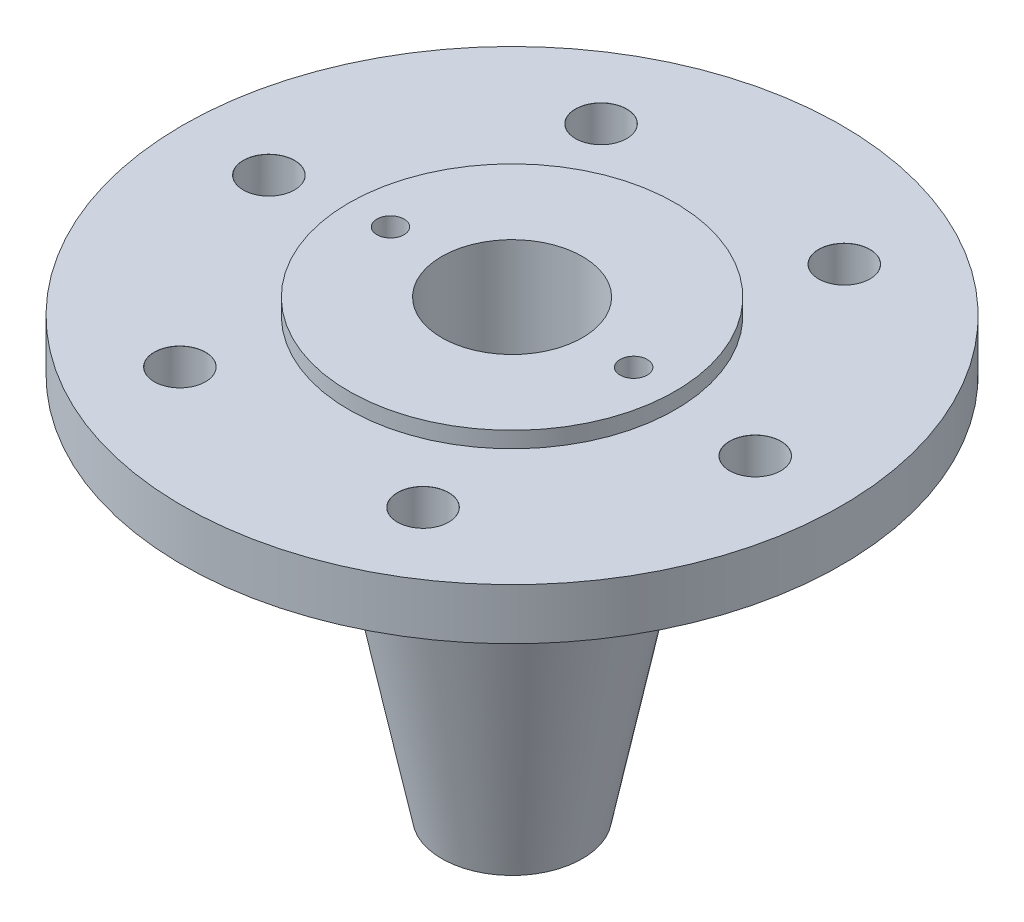
ISO-10303-21;
HEADER;
FILE_DESCRIPTION(('STEP AP214'),'2;1');
FILE_NAME('part.step','',(''),(''),'','','');
FILE_SCHEMA(('AUTOMOTIVE_DESIGN { 1 0 10303 214 1 1 1 1 }'));
ENDSEC;
DATA;
#1=APPLICATION_CONTEXT('core data for automotive mechanical design processes');
#2=APPLICATION_PROTOCOL_DEFINITION('international standard','automotive_design',2000,#1);
#3=PRODUCT_CONTEXT('',#1,'mechanical');
#4=PRODUCT('Part','Part','',(#3));
#5=PRODUCT_RELATED_PRODUCT_CATEGORY('part','',(#4));
#6=PRODUCT_DEFINITION_FORMATION('','',#4);
#7=PRODUCT_DEFINITION_CONTEXT('part definition',#1,'design');
#8=PRODUCT_DEFINITION('design','',#6,#7);
#9=PRODUCT_DEFINITION_SHAPE('','',#8);
#10=(LENGTH_UNIT() NAMED_UNIT(*) SI_UNIT(.MILLI.,.METRE.));
#11=(NAMED_UNIT(*) PLANE_ANGLE_UNIT() SI_UNIT($,.RADIAN.));
#12=(NAMED_UNIT(*) SI_UNIT($,.STERADIAN.) SOLID_ANGLE_UNIT());
#13=UNCERTAINTY_MEASURE_WITH_UNIT(LENGTH_MEASURE(1.E-05),#10,'distance_accuracy_value','');
#14=(GEOMETRIC_REPRESENTATION_CONTEXT(3) GLOBAL_UNCERTAINTY_ASSIGNED_CONTEXT((#13)) GLOBAL_UNIT_ASSIGNED_CONTEXT((#10,
#11,#12)) REPRESENTATION_CONTEXT('',''));
#15=CARTESIAN_POINT('',(0.,0.,0.));
#16=DIRECTION('',(0.,0.,1.));
#17=DIRECTION('',(1.,0.,0.));
#18=AXIS2_PLACEMENT_3D('',#15,#16,#17);
#19=CARTESIAN_POINT('',(51.,-5.,0.));
#20=DIRECTION('',(0.,-1.,0.));
#21=DIRECTION('',(1.,0.,0.));
#22=AXIS2_PLACEMENT_3D('',#19,#20,#21);
#23=PLANE('',#22);
#24=CARTESIAN_POINT('',(0.,-5.,0.));
#25=DIRECTION('',(0.,1.,0.));
#26=DIRECTION('',(-1.,0.,0.));
#27=AXIS2_PLACEMENT_3D('',#24,#25,#26);
#28=CIRCLE('',#27,51.);
#29=CARTESIAN_POINT('',(-51.,-5.00000000000001,0.));
#30=VERTEX_POINT('',#29);
#31=EDGE_CURVE('E219',#30,#30,#28,.T.);
#32=ORIENTED_EDGE('',*,*,#31,.F.);
#33=EDGE_LOOP('',(#32));
#34=FACE_BOUND('',#33,.T.);
#35=CARTESIAN_POINT('',(0.,-5.,0.));
#36=DIRECTION('',(0.,1.,0.));
#37=DIRECTION('',(-1.,0.,0.));
#38=AXIS2_PLACEMENT_3D('',#35,#36,#37);
#39=CIRCLE('',#38,103.);
#40=CARTESIAN_POINT('',(-103.,-5.00000000000002,0.));
#41=VERTEX_POINT('',#40);
#42=EDGE_CURVE('E215',#41,#41,#39,.T.);
#43=ORIENTED_EDGE('',*,*,#42,.T.);
#44=EDGE_LOOP('',(#43));
#45=FACE_BOUND('',#44,.T.);
#46=CARTESIAN_POINT('',(-76.,-5.,0.));
#47=DIRECTION('',(0.,1.,0.));
#48=DIRECTION('',(0.,0.,1.));
#49=AXIS2_PLACEMENT_3D('',#46,#47,#48);
#50=CIRCLE('',#49,8.025);
#51=CARTESIAN_POINT('',(-76.,-5.,8.025));
#52=VERTEX_POINT('',#51);
#53=EDGE_CURVE('E155',#52,#52,#50,.T.);
#54=ORIENTED_EDGE('',*,*,#53,.F.);
#55=EDGE_LOOP('',(#54));
#56=FACE_BOUND('',#55,.T.);
#57=CARTESIAN_POINT('',(-37.9999999999998,-5.,65.8179306876174));
#58=DIRECTION('',(0.,1.,0.));
#59=DIRECTION('',(0.,0.,1.));
#60=AXIS2_PLACEMENT_3D('',#57,#58,#59);
#61=CIRCLE('',#60,8.025);
#62=CARTESIAN_POINT('',(-37.9999999999998,-5.,73.8429306876174));
#63=VERTEX_POINT('',#62);
#64=EDGE_CURVE('E143',#63,#63,#61,.T.);
#65=ORIENTED_EDGE('',*,*,#64,.F.);
#66=EDGE_LOOP('',(#65));
#67=FACE_BOUND('',#66,.T.);
#68=CARTESIAN_POINT('',(38.0000000000003,-5.,65.8179306876172));
#69=DIRECTION('',(0.,1.,0.));
#70=DIRECTION('',(0.,0.,1.));
#71=AXIS2_PLACEMENT_3D('',#68,#69,#70);
#72=CIRCLE('',#71,8.025);
#73=CARTESIAN_POINT('',(38.0000000000003,-5.,73.8429306876172));
#74=VERTEX_POINT('',#73);
#75=EDGE_CURVE('E131',#74,#74,#72,.T.);
#76=ORIENTED_EDGE('',*,*,#75,.F.);
#77=EDGE_LOOP('',(#76));
#78=FACE_BOUND('',#77,.T.);
#79=CARTESIAN_POINT('',(76.,-5.,0.));
#80=DIRECTION('',(0.,1.,0.));
#81=DIRECTION('',(0.,0.,1.));
#82=AXIS2_PLACEMENT_3D('',#79,#80,#81);
#83=CIRCLE('',#82,8.025);
#84=CARTESIAN_POINT('',(76.,-5.,8.025));
#85=VERTEX_POINT('',#84);
#86=EDGE_CURVE('E119',#85,#85,#83,.T.);
#87=ORIENTED_EDGE('',*,*,#86,.F.);
#88=EDGE_LOOP('',(#87));
#89=FACE_BOUND('',#88,.T.);
#90=CARTESIAN_POINT('',(37.9999999999994,-5.,-65.8179306876177));
#91=DIRECTION('',(0.,1.,0.));
#92=DIRECTION('',(0.,0.,1.));
#93=AXIS2_PLACEMENT_3D('',#90,#91,#92);
#94=CIRCLE('',#93,8.025);
#95=CARTESIAN_POINT('',(37.9999999999994,-5.,-57.7929306876177));
#96=VERTEX_POINT('',#95);
#97=EDGE_CURVE('E107',#96,#96,#94,.T.);
#98=ORIENTED_EDGE('',*,*,#97,.F.);
#99=EDGE_LOOP('',(#98));
#100=FACE_BOUND('',#99,.T.);
#101=CARTESIAN_POINT('',(-38.0000000000008,-5.,-65.8179306876169));
#102=DIRECTION('',(0.,1.,0.));
#103=DIRECTION('',(0.,0.,1.));
#104=AXIS2_PLACEMENT_3D('',#101,#102,#103);
#105=CIRCLE('',#104,8.025);
#106=CARTESIAN_POINT('',(-38.0000000000008,-5.,-57.7929306876169));
#107=VERTEX_POINT('',#106);
#108=EDGE_CURVE('E95',#107,#107,#105,.T.);
#109=ORIENTED_EDGE('',*,*,#108,.F.);
#110=EDGE_LOOP('',(#109));
#111=FACE_BOUND('',#110,.T.);
#112=ADVANCED_FACE('F54',(#34,#45,#56,#67,#78,#89,#100,#111),#23,.F.);
#113=CARTESIAN_POINT('',(0.,0.,0.));
#114=DIRECTION('',(0.,-1.,0.));
#115=DIRECTION('',(1.,0.,0.));
#116=AXIS2_PLACEMENT_3D('',#113,#114,#115);
#117=PLANE('',#116);
#118=CARTESIAN_POINT('',(-38.,0.,0.));
#119=DIRECTION('',(0.,1.,0.));
#120=DIRECTION('',(0.,0.,1.));
#121=AXIS2_PLACEMENT_3D('',#118,#119,#120);
#122=CIRCLE('',#121,4.24999999999999);
#123=CARTESIAN_POINT('',(-38.,0.,4.24999999999999));
#124=VERTEX_POINT('',#123);
#125=EDGE_CURVE('E81',#124,#124,#122,.T.);
#126=ORIENTED_EDGE('',*,*,#125,.F.);
#127=EDGE_LOOP('',(#126));
#128=FACE_BOUND('',#127,.T.);
#129=CARTESIAN_POINT('',(38.,0.,0.));
#130=DIRECTION('',(0.,1.,0.));
#131=DIRECTION('',(0.,0.,1.));
#132=AXIS2_PLACEMENT_3D('',#129,#130,#131);
#133=CIRCLE('',#132,4.24999999999999);
#134=CARTESIAN_POINT('',(38.,0.,4.24999999999999));
#135=VERTEX_POINT('',#134);
#136=EDGE_CURVE('E80',#135,#135,#133,.T.);
#137=ORIENTED_EDGE('',*,*,#136,.F.);
#138=EDGE_LOOP('',(#137));
#139=FACE_BOUND('',#138,.T.);
#140=CARTESIAN_POINT('',(0.,0.,0.));
#141=DIRECTION('',(0.,1.,0.));
#142=DIRECTION('',(-1.,0.,0.));
#143=AXIS2_PLACEMENT_3D('',#140,#141,#142);
#144=CIRCLE('',#143,22.);
#145=CARTESIAN_POINT('',(-22.,0.,0.));
#146=VERTEX_POINT('',#145);
#147=EDGE_CURVE('E195',#146,#146,#144,.T.);
#148=ORIENTED_EDGE('',*,*,#147,.F.);
#149=EDGE_LOOP('',(#148));
#150=FACE_BOUND('',#149,.T.);
#151=CARTESIAN_POINT('',(0.,0.,0.));
#152=DIRECTION('',(0.,1.,0.));
#153=DIRECTION('',(-1.,0.,0.));
#154=AXIS2_PLACEMENT_3D('',#151,#152,#153);
#155=CIRCLE('',#154,51.);
#156=CARTESIAN_POINT('',(-51.,0.,0.));
#157=VERTEX_POINT('',#156);
#158=EDGE_CURVE('E223',#157,#157,#155,.T.);
#159=ORIENTED_EDGE('',*,*,#158,.T.);
#160=EDGE_LOOP('',(#159));
#161=FACE_BOUND('',#160,.T.);
#162=ADVANCED_FACE('F250',(#128,#139,#150,#161),#117,.F.);
#163=CARTESIAN_POINT('',(0.,0.,0.));
#164=DIRECTION('',(0.,1.,0.));
#165=DIRECTION('',(-1.,0.,0.));
#166=AXIS2_PLACEMENT_3D('',#163,#164,#165);
#167=CYLINDRICAL_SURFACE('',#166,51.);
#168=ORIENTED_EDGE('',*,*,#158,.F.);
#169=EDGE_LOOP('',(#168));
#170=FACE_BOUND('',#169,.T.);
#171=ORIENTED_EDGE('',*,*,#31,.T.);
#172=EDGE_LOOP('',(#171));
#173=FACE_BOUND('',#172,.T.);
#174=ADVANCED_FACE('F256',(#170,#173),#167,.T.);
#175=CARTESIAN_POINT('',(0.,0.,0.));
#176=DIRECTION('',(0.,1.,0.));
#177=DIRECTION('',(-1.,0.,0.));
#178=AXIS2_PLACEMENT_3D('',#175,#176,#177);
#179=CYLINDRICAL_SURFACE('',#178,103.);
#180=ORIENTED_EDGE('',*,*,#42,.F.);
#181=EDGE_LOOP('',(#180));
#182=FACE_BOUND('',#181,.T.);
#183=CARTESIAN_POINT('',(0.,-21.,0.));
#184=DIRECTION('',(0.,1.,0.));
#185=DIRECTION('',(-1.,0.,0.));
#186=AXIS2_PLACEMENT_3D('',#183,#184,#185);
#187=CIRCLE('',#186,103.);
#188=CARTESIAN_POINT('',(-103.,-21.,0.));
#189=VERTEX_POINT('',#188);
#190=EDGE_CURVE('E211',#189,#189,#187,.T.);
#191=ORIENTED_EDGE('',*,*,#190,.T.);
#192=EDGE_LOOP('',(#191));
#193=FACE_BOUND('',#192,.T.);
#194=ADVANCED_FACE('F262',(#182,#193),#179,.T.);
#195=CARTESIAN_POINT('',(103.,-21.,0.));
#196=DIRECTION('',(0.,1.,0.));
#197=DIRECTION('',(-1.,0.,0.));
#198=AXIS2_PLACEMENT_3D('',#195,#196,#197);
#199=PLANE('',#198);
#200=CARTESIAN_POINT('',(-38.0000000000008,-21.,-65.8179306876169));
#201=DIRECTION('',(0.,1.,0.));
#202=DIRECTION('',(-1.,0.,0.));
#203=AXIS2_PLACEMENT_3D('',#200,#201,#202);
#204=CIRCLE('',#203,7.99999999999999);
#205=CARTESIAN_POINT('',(-46.0000000000008,-21.,-65.8179306876169));
#206=VERTEX_POINT('',#205);
#207=EDGE_CURVE('E103',#206,#206,#204,.T.);
#208=ORIENTED_EDGE('',*,*,#207,.T.);
#209=EDGE_LOOP('',(#208));
#210=FACE_BOUND('',#209,.T.);
#211=CARTESIAN_POINT('',(37.9999999999994,-21.,-65.8179306876177));
#212=DIRECTION('',(0.,1.,0.));
#213=DIRECTION('',(-1.,0.,0.));
#214=AXIS2_PLACEMENT_3D('',#211,#212,#213);
#215=CIRCLE('',#214,7.99999999999999);
#216=CARTESIAN_POINT('',(29.9999999999994,-21.,-65.8179306876177));
#217=VERTEX_POINT('',#216);
#218=EDGE_CURVE('E115',#217,#217,#215,.T.);
#219=ORIENTED_EDGE('',*,*,#218,.T.);
#220=EDGE_LOOP('',(#219));
#221=FACE_BOUND('',#220,.T.);
#222=CARTESIAN_POINT('',(76.,-21.,0.));
#223=DIRECTION('',(0.,1.,0.));
#224=DIRECTION('',(-1.,0.,0.));
#225=AXIS2_PLACEMENT_3D('',#222,#223,#224);
#226=CIRCLE('',#225,7.99999999999999);
#227=CARTESIAN_POINT('',(68.,-21.,0.));
#228=VERTEX_POINT('',#227);
#229=EDGE_CURVE('E127',#228,#228,#226,.T.);
#230=ORIENTED_EDGE('',*,*,#229,.T.);
#231=EDGE_LOOP('',(#230));
#232=FACE_BOUND('',#231,.T.);
#233=CARTESIAN_POINT('',(38.0000000000003,-21.,65.8179306876172));
#234=DIRECTION('',(0.,1.,0.));
#235=DIRECTION('',(-1.,0.,0.));
#236=AXIS2_PLACEMENT_3D('',#233,#234,#235);
#237=CIRCLE('',#236,7.99999999999999);
#238=CARTESIAN_POINT('',(30.0000000000003,-21.,65.8179306876172));
#239=VERTEX_POINT('',#238);
#240=EDGE_CURVE('E139',#239,#239,#237,.T.);
#241=ORIENTED_EDGE('',*,*,#240,.T.);
#242=EDGE_LOOP('',(#241));
#243=FACE_BOUND('',#242,.T.);
#244=CARTESIAN_POINT('',(-37.9999999999998,-21.,65.8179306876174));
#245=DIRECTION('',(0.,1.,0.));
#246=DIRECTION('',(-1.,0.,0.));
#247=AXIS2_PLACEMENT_3D('',#244,#245,#246);
#248=CIRCLE('',#247,7.99999999999999);
#249=CARTESIAN_POINT('',(-45.9999999999998,-21.,65.8179306876174));
#250=VERTEX_POINT('',#249);
#251=EDGE_CURVE('E151',#250,#250,#248,.T.);
#252=ORIENTED_EDGE('',*,*,#251,.T.);
#253=EDGE_LOOP('',(#252));
#254=FACE_BOUND('',#253,.T.);
#255=CARTESIAN_POINT('',(-76.,-21.,0.));
#256=DIRECTION('',(0.,1.,0.));
#257=DIRECTION('',(-1.,0.,0.));
#258=AXIS2_PLACEMENT_3D('',#255,#256,#257);
#259=CIRCLE('',#258,7.99999999999999);
#260=CARTESIAN_POINT('',(-84.,-21.,0.));
#261=VERTEX_POINT('',#260);
#262=EDGE_CURVE('E163',#261,#261,#259,.T.);
#263=ORIENTED_EDGE('',*,*,#262,.T.);
#264=EDGE_LOOP('',(#263));
#265=FACE_BOUND('',#264,.T.);
#266=ORIENTED_EDGE('',*,*,#190,.F.);
#267=EDGE_LOOP('',(#266));
#268=FACE_BOUND('',#267,.T.);
#269=CARTESIAN_POINT('',(0.,-21.,0.));
#270=DIRECTION('',(0.,1.,0.));
#271=DIRECTION('',(-1.,0.,0.));
#272=AXIS2_PLACEMENT_3D('',#269,#270,#271);
#273=CIRCLE('',#272,54.);
#274=CARTESIAN_POINT('',(-54.,-21.,0.));
#275=VERTEX_POINT('',#274);
#276=EDGE_CURVE('E207',#275,#275,#273,.T.);
#277=ORIENTED_EDGE('',*,*,#276,.T.);
#278=EDGE_LOOP('',(#277));
#279=FACE_BOUND('',#278,.T.);
#280=ADVANCED_FACE('F269',(#210,#221,#232,#243,#254,#265,#268,#279),#199,.F.);
#281=CARTESIAN_POINT('',(0.,0.,0.));
#282=DIRECTION('',(0.,1.,0.));
#283=DIRECTION('',(-1.,0.,0.));
#284=AXIS2_PLACEMENT_3D('',#281,#282,#283);
#285=CYLINDRICAL_SURFACE('',#284,54.);
#286=ORIENTED_EDGE('',*,*,#276,.F.);
#287=EDGE_LOOP('',(#286));
#288=FACE_BOUND('',#287,.T.);
#289=CARTESIAN_POINT('',(0.,-31.,0.));
#290=DIRECTION('',(0.,1.,0.));
#291=DIRECTION('',(-1.,0.,0.));
#292=AXIS2_PLACEMENT_3D('',#289,#290,#291);
#293=CIRCLE('',#292,54.);
#294=CARTESIAN_POINT('',(-54.,-31.,0.));
#295=VERTEX_POINT('',#294);
#296=EDGE_CURVE('E203',#295,#295,#293,.T.);
#297=ORIENTED_EDGE('',*,*,#296,.T.);
#298=EDGE_LOOP('',(#297));
#299=FACE_BOUND('',#298,.T.);
#300=ADVANCED_FACE('F277',(#288,#299),#285,.T.);
#301=CARTESIAN_POINT('',(54.,-31.,0.));
#302=DIRECTION('',(0.,1.,0.));
#303=DIRECTION('',(-1.,0.,0.));
#304=AXIS2_PLACEMENT_3D('',#301,#302,#303);
#305=PLANE('',#304);
#306=CARTESIAN_POINT('',(0.,-31.,0.));
#307=DIRECTION('',(0.,1.,0.));
#308=DIRECTION('',(-1.,0.,0.));
#309=AXIS2_PLACEMENT_3D('',#306,#307,#308);
#310=CIRCLE('',#309,48.0990195135928);
#311=CARTESIAN_POINT('',(-48.0990195135928,-31.,0.));
#312=VERTEX_POINT('',#311);
#313=EDGE_CURVE('E63',#312,#312,#310,.T.);
#314=ORIENTED_EDGE('',*,*,#313,.T.);
#315=EDGE_LOOP('',(#314));
#316=FACE_BOUND('',#315,.T.);
#317=ORIENTED_EDGE('',*,*,#296,.F.);
#318=EDGE_LOOP('',(#317));
#319=FACE_BOUND('',#318,.T.);
#320=ADVANCED_FACE('F231',(#316,#319),#305,.F.);
#321=CARTESIAN_POINT('',(0.,-141.,0.));
#322=DIRECTION('',(0.,1.,0.));
#323=DIRECTION('',(-1.,0.,0.));
#324=AXIS2_PLACEMENT_3D('',#321,#322,#323);
#325=CONICAL_SURFACE('',#324,22.,0.197395559849881);
#326=CARTESIAN_POINT('',(0.,-35.0194193243091,0.));
#327=DIRECTION('',(0.,1.,0.));
#328=DIRECTION('',(-1.,0.,0.));
#329=AXIS2_PLACEMENT_3D('',#326,#327,#328);
#330=CIRCLE('',#329,43.1961161351382);
#331=CARTESIAN_POINT('',(-43.1961161351382,-35.0194193243091,0.));
#332=VERTEX_POINT('',#331);
#333=EDGE_CURVE('E13',#332,#332,#330,.F.);
#334=ORIENTED_EDGE('',*,*,#333,.T.);
#335=EDGE_LOOP('',(#334));
#336=FACE_BOUND('',#335,.T.);
#337=CARTESIAN_POINT('',(0.,-141.,0.));
#338=DIRECTION('',(0.,1.,0.));
#339=DIRECTION('',(-1.,0.,0.));
#340=AXIS2_PLACEMENT_3D('',#337,#338,#339);
#341=CIRCLE('',#340,22.);
#342=CARTESIAN_POINT('',(-22.,-141.,0.));
#343=VERTEX_POINT('',#342);
#344=EDGE_CURVE('E199',#343,#343,#341,.T.);
#345=ORIENTED_EDGE('',*,*,#344,.T.);
#346=EDGE_LOOP('',(#345));
#347=FACE_BOUND('',#346,.T.);
#348=ADVANCED_FACE('F291',(#336,#347),#325,.T.);
#349=CARTESIAN_POINT('',(22.,-141.,0.));
#350=DIRECTION('',(0.,1.,0.));
#351=DIRECTION('',(-1.,0.,0.));
#352=AXIS2_PLACEMENT_3D('',#349,#350,#351);
#353=PLANE('',#352);
#354=CARTESIAN_POINT('',(0.,-141.,0.));
#355=DIRECTION('',(0.,1.,0.));
#356=DIRECTION('',(-1.,0.,0.));
#357=AXIS2_PLACEMENT_3D('',#354,#355,#356);
#358=CIRCLE('',#357,11.75);
#359=CARTESIAN_POINT('',(-11.75,-141.,0.));
#360=VERTEX_POINT('',#359);
#361=EDGE_CURVE('E167',#360,#360,#358,.T.);
#362=ORIENTED_EDGE('',*,*,#361,.T.);
#363=EDGE_LOOP('',(#362));
#364=FACE_BOUND('',#363,.T.);
#365=ORIENTED_EDGE('',*,*,#344,.F.);
#366=EDGE_LOOP('',(#365));
#367=FACE_BOUND('',#366,.T.);
#368=ADVANCED_FACE('F296',(#364,#367),#353,.F.);
#369=CARTESIAN_POINT('',(0.,0.,0.));
#370=DIRECTION('',(0.,1.,0.));
#371=DIRECTION('',(-1.,0.,0.));
#372=AXIS2_PLACEMENT_3D('',#369,#370,#371);
#373=CYLINDRICAL_SURFACE('',#372,22.);
#374=CARTESIAN_POINT('',(0.,-44.,0.));
#375=DIRECTION('',(0.,1.,0.));
#376=DIRECTION('',(-1.,0.,0.));
#377=AXIS2_PLACEMENT_3D('',#374,#375,#376);
#378=CIRCLE('',#377,22.);
#379=CARTESIAN_POINT('',(-22.,-44.,0.));
#380=VERTEX_POINT('',#379);
#381=EDGE_CURVE('E191',#380,#380,#378,.T.);
#382=ORIENTED_EDGE('',*,*,#381,.F.);
#383=EDGE_LOOP('',(#382));
#384=FACE_BOUND('',#383,.T.);
#385=ORIENTED_EDGE('',*,*,#147,.T.);
#386=EDGE_LOOP('',(#385));
#387=FACE_BOUND('',#386,.T.);
#388=ADVANCED_FACE('F302',(#384,#387),#373,.F.);
#389=CARTESIAN_POINT('',(0.,-44.,0.));
#390=DIRECTION('',(0.,1.,0.));
#391=DIRECTION('',(-1.,0.,0.));
#392=AXIS2_PLACEMENT_3D('',#389,#390,#391);
#393=CONICAL_SURFACE('',#392,22.,0.994837673636774);
#394=CARTESIAN_POINT('',(0.,-51.1434835251725,0.));
#395=DIRECTION('',(0.,1.,0.));
#396=DIRECTION('',(-1.,0.,0.));
#397=AXIS2_PLACEMENT_3D('',#394,#395,#396);
#398=CIRCLE('',#397,11.);
#399=CARTESIAN_POINT('',(-11.,-51.1434835251725,0.));
#400=VERTEX_POINT('',#399);
#401=EDGE_CURVE('E187',#400,#400,#398,.T.);
#402=ORIENTED_EDGE('',*,*,#401,.F.);
#403=EDGE_LOOP('',(#402));
#404=FACE_BOUND('',#403,.T.);
#405=ORIENTED_EDGE('',*,*,#381,.T.);
#406=EDGE_LOOP('',(#405));
#407=FACE_BOUND('',#406,.T.);
#408=ADVANCED_FACE('F306',(#404,#407),#393,.F.);
#409=CARTESIAN_POINT('',(0.,0.,0.));
#410=DIRECTION('',(0.,1.,0.));
#411=DIRECTION('',(-1.,0.,0.));
#412=AXIS2_PLACEMENT_3D('',#409,#410,#411);
#413=CYLINDRICAL_SURFACE('',#412,11.);
#414=CARTESIAN_POINT('',(0.,-83.,0.));
#415=DIRECTION('',(0.,1.,0.));
#416=DIRECTION('',(-1.,0.,0.));
#417=AXIS2_PLACEMENT_3D('',#414,#415,#416);
#418=CIRCLE('',#417,11.);
#419=CARTESIAN_POINT('',(-11.,-83.,0.));
#420=VERTEX_POINT('',#419);
#421=EDGE_CURVE('E183',#420,#420,#418,.T.);
#422=ORIENTED_EDGE('',*,*,#421,.F.);
#423=EDGE_LOOP('',(#422));
#424=FACE_BOUND('',#423,.T.);
#425=ORIENTED_EDGE('',*,*,#401,.T.);
#426=EDGE_LOOP('',(#425));
#427=FACE_BOUND('',#426,.T.);
#428=ADVANCED_FACE('F310',(#424,#427),#413,.F.);
#429=CARTESIAN_POINT('',(0.,-83.,0.));
#430=DIRECTION('',(0.,-1.,0.));
#431=DIRECTION('',(1.,0.,0.));
#432=AXIS2_PLACEMENT_3D('',#429,#430,#431);
#433=CONICAL_SURFACE('',#432,11.,0.994837673636767);
#434=CARTESIAN_POINT('',(0.,-86.2470379659876,0.));
#435=DIRECTION('',(0.,1.,0.));
#436=DIRECTION('',(-1.,0.,0.));
#437=AXIS2_PLACEMENT_3D('',#434,#435,#436);
#438=CIRCLE('',#437,16.);
#439=CARTESIAN_POINT('',(-16.,-86.2470379659876,0.));
#440=VERTEX_POINT('',#439);
#441=EDGE_CURVE('E179',#440,#440,#438,.T.);
#442=ORIENTED_EDGE('',*,*,#441,.F.);
#443=EDGE_LOOP('',(#442));
#444=FACE_BOUND('',#443,.T.);
#445=ORIENTED_EDGE('',*,*,#421,.T.);
#446=EDGE_LOOP('',(#445));
#447=FACE_BOUND('',#446,.T.);
#448=ADVANCED_FACE('F314',(#444,#447),#433,.F.);
#449=CARTESIAN_POINT('',(0.,0.,0.));
#450=DIRECTION('',(0.,1.,0.));
#451=DIRECTION('',(-1.,0.,0.));
#452=AXIS2_PLACEMENT_3D('',#449,#450,#451);
#453=CYLINDRICAL_SURFACE('',#452,16.);
#454=CARTESIAN_POINT('',(0.,-100.240017728911,0.));
#455=DIRECTION('',(0.,1.,0.));
#456=DIRECTION('',(-1.,0.,0.));
#457=AXIS2_PLACEMENT_3D('',#454,#455,#456);
#458=CIRCLE('',#457,16.);
#459=CARTESIAN_POINT('',(-16.,-100.240017728911,0.));
#460=VERTEX_POINT('',#459);
#461=EDGE_CURVE('E175',#460,#460,#458,.T.);
#462=ORIENTED_EDGE('',*,*,#461,.F.);
#463=EDGE_LOOP('',(#462));
#464=FACE_BOUND('',#463,.T.);
#465=ORIENTED_EDGE('',*,*,#441,.T.);
#466=EDGE_LOOP('',(#465));
#467=FACE_BOUND('',#466,.T.);
#468=ADVANCED_FACE('F318',(#464,#467),#453,.F.);
#469=CARTESIAN_POINT('',(0.,-100.240017728911,0.));
#470=DIRECTION('',(0.,1.,0.));
#471=DIRECTION('',(-1.,0.,0.));
#472=AXIS2_PLACEMENT_3D('',#469,#470,#471);
#473=CONICAL_SURFACE('',#472,16.,0.994837673636775);
#474=CARTESIAN_POINT('',(0.,-103.,0.));
#475=DIRECTION('',(0.,1.,0.));
#476=DIRECTION('',(-1.,0.,0.));
#477=AXIS2_PLACEMENT_3D('',#474,#475,#476);
#478=CIRCLE('',#477,11.75);
#479=CARTESIAN_POINT('',(-11.75,-103.,0.));
#480=VERTEX_POINT('',#479);
#481=EDGE_CURVE('E171',#480,#480,#478,.T.);
#482=ORIENTED_EDGE('',*,*,#481,.F.);
#483=EDGE_LOOP('',(#482));
#484=FACE_BOUND('',#483,.T.);
#485=ORIENTED_EDGE('',*,*,#461,.T.);
#486=EDGE_LOOP('',(#485));
#487=FACE_BOUND('',#486,.T.);
#488=ADVANCED_FACE('F245',(#484,#487),#473,.F.);
#489=CARTESIAN_POINT('',(0.,0.,0.));
#490=DIRECTION('',(0.,1.,0.));
#491=DIRECTION('',(-1.,0.,0.));
#492=AXIS2_PLACEMENT_3D('',#489,#490,#491);
#493=CYLINDRICAL_SURFACE('',#492,11.75);
#494=ORIENTED_EDGE('',*,*,#361,.F.);
#495=EDGE_LOOP('',(#494));
#496=FACE_BOUND('',#495,.T.);
#497=ORIENTED_EDGE('',*,*,#481,.T.);
#498=EDGE_LOOP('',(#497));
#499=FACE_BOUND('',#498,.T.);
#500=ADVANCED_FACE('F236',(#496,#499),#493,.F.);
#501=CARTESIAN_POINT('',(0.,-36.,0.));
#502=DIRECTION('',(0.,1.,0.));
#503=DIRECTION('',(-1.,0.,0.));
#504=AXIS2_PLACEMENT_3D('',#501,#502,#503);
#505=TOROIDAL_SURFACE('',#504,48.0990195135928,5.);
#506=ORIENTED_EDGE('',*,*,#333,.F.);
#507=EDGE_LOOP('',(#506));
#508=FACE_BOUND('',#507,.T.);
#509=ORIENTED_EDGE('',*,*,#313,.F.);
#510=EDGE_LOOP('',(#509));
#511=FACE_BOUND('',#510,.T.);
#512=ADVANCED_FACE('F56',(#508,#511),#505,.F.);
#513=CARTESIAN_POINT('',(-76.,-5.,0.));
#514=DIRECTION('',(0.,1.,0.));
#515=DIRECTION('',(0.,0.,1.));
#516=AXIS2_PLACEMENT_3D('',#513,#514,#515);
#517=CYLINDRICAL_SURFACE('',#516,7.99999999999999);
#518=ORIENTED_EDGE('',*,*,#262,.F.);
#519=EDGE_LOOP('',(#518));
#520=FACE_BOUND('',#519,.T.);
#521=CARTESIAN_POINT('',(-76.,-5.02500000000006,0.));
#522=DIRECTION('',(0.,1.,0.));
#523=DIRECTION('',(0.,0.,1.));
#524=AXIS2_PLACEMENT_3D('',#521,#522,#523);
#525=CIRCLE('',#524,7.99999999999999);
#526=CARTESIAN_POINT('',(-76.,-5.02500000000006,7.99999999999999));
#527=VERTEX_POINT('',#526);
#528=EDGE_CURVE('E159',#527,#527,#525,.T.);
#529=ORIENTED_EDGE('',*,*,#528,.T.);
#530=EDGE_LOOP('',(#529));
#531=FACE_BOUND('',#530,.T.);
#532=ADVANCED_FACE('F235',(#520,#531),#517,.F.);
#533=CARTESIAN_POINT('',(-76.,-5.,0.));
#534=DIRECTION('',(0.,1.,0.));
#535=DIRECTION('',(0.,0.,1.));
#536=AXIS2_PLACEMENT_3D('',#533,#534,#535);
#537=CONICAL_SURFACE('',#536,8.025,0.785398163397431);
#538=ORIENTED_EDGE('',*,*,#528,.F.);
#539=EDGE_LOOP('',(#538));
#540=FACE_BOUND('',#539,.T.);
#541=ORIENTED_EDGE('',*,*,#53,.T.);
#542=EDGE_LOOP('',(#541));
#543=FACE_BOUND('',#542,.T.);
#544=ADVANCED_FACE('F242',(#540,#543),#537,.F.);
#545=CARTESIAN_POINT('',(-37.9999999999998,-5.,65.8179306876174));
#546=DIRECTION('',(0.,1.,0.));
#547=DIRECTION('',(0.,0.,1.));
#548=AXIS2_PLACEMENT_3D('',#545,#546,#547);
#549=CYLINDRICAL_SURFACE('',#548,7.99999999999999);
#550=ORIENTED_EDGE('',*,*,#251,.F.);
#551=EDGE_LOOP('',(#550));
#552=FACE_BOUND('',#551,.T.);
#553=CARTESIAN_POINT('',(-37.9999999999998,-5.025,65.8179306876174));
#554=DIRECTION('',(0.,1.,0.));
#555=DIRECTION('',(0.,0.,1.));
#556=AXIS2_PLACEMENT_3D('',#553,#554,#555);
#557=CIRCLE('',#556,7.99999999999999);
#558=CARTESIAN_POINT('',(-37.9999999999998,-5.025,73.8179306876174));
#559=VERTEX_POINT('',#558);
#560=EDGE_CURVE('E147',#559,#559,#557,.T.);
#561=ORIENTED_EDGE('',*,*,#560,.T.);
#562=EDGE_LOOP('',(#561));
#563=FACE_BOUND('',#562,.T.);
#564=ADVANCED_FACE('F328',(#552,#563),#549,.F.);
#565=CARTESIAN_POINT('',(-37.9999999999998,-5.,65.8179306876174));
#566=DIRECTION('',(0.,1.,0.));
#567=DIRECTION('',(0.,0.,1.));
#568=AXIS2_PLACEMENT_3D('',#565,#566,#567);
#569=CONICAL_SURFACE('',#568,8.025,0.785398163397431);
#570=ORIENTED_EDGE('',*,*,#560,.F.);
#571=EDGE_LOOP('',(#570));
#572=FACE_BOUND('',#571,.T.);
#573=ORIENTED_EDGE('',*,*,#64,.T.);
#574=EDGE_LOOP('',(#573));
#575=FACE_BOUND('',#574,.T.);
#576=ADVANCED_FACE('F332',(#572,#575),#569,.F.);
#577=CARTESIAN_POINT('',(38.0000000000003,-5.,65.8179306876172));
#578=DIRECTION('',(0.,1.,0.));
#579=DIRECTION('',(0.,0.,1.));
#580=AXIS2_PLACEMENT_3D('',#577,#578,#579);
#581=CYLINDRICAL_SURFACE('',#580,7.99999999999999);
#582=ORIENTED_EDGE('',*,*,#240,.F.);
#583=EDGE_LOOP('',(#582));
#584=FACE_BOUND('',#583,.T.);
#585=CARTESIAN_POINT('',(38.0000000000003,-5.025,65.8179306876172));
#586=DIRECTION('',(0.,1.,0.));
#587=DIRECTION('',(0.,0.,1.));
#588=AXIS2_PLACEMENT_3D('',#585,#586,#587);
#589=CIRCLE('',#588,7.99999999999999);
#590=CARTESIAN_POINT('',(38.0000000000003,-5.025,73.8179306876172));
#591=VERTEX_POINT('',#590);
#592=EDGE_CURVE('E135',#591,#591,#589,.T.);
#593=ORIENTED_EDGE('',*,*,#592,.T.);
#594=EDGE_LOOP('',(#593));
#595=FACE_BOUND('',#594,.T.);
#596=ADVANCED_FACE('F336',(#584,#595),#581,.F.);
#597=CARTESIAN_POINT('',(38.0000000000003,-5.,65.8179306876172));
#598=DIRECTION('',(0.,1.,0.));
#599=DIRECTION('',(0.,0.,1.));
#600=AXIS2_PLACEMENT_3D('',#597,#598,#599);
#601=CONICAL_SURFACE('',#600,8.025,0.785398163397431);
#602=ORIENTED_EDGE('',*,*,#592,.F.);
#603=EDGE_LOOP('',(#602));
#604=FACE_BOUND('',#603,.T.);
#605=ORIENTED_EDGE('',*,*,#75,.T.);
#606=EDGE_LOOP('',(#605));
#607=FACE_BOUND('',#606,.T.);
#608=ADVANCED_FACE('F340',(#604,#607),#601,.F.);
#609=CARTESIAN_POINT('',(76.,-5.,0.));
#610=DIRECTION('',(0.,1.,0.));
#611=DIRECTION('',(0.,0.,1.));
#612=AXIS2_PLACEMENT_3D('',#609,#610,#611);
#613=CYLINDRICAL_SURFACE('',#612,7.99999999999999);
#614=ORIENTED_EDGE('',*,*,#229,.F.);
#615=EDGE_LOOP('',(#614));
#616=FACE_BOUND('',#615,.T.);
#617=CARTESIAN_POINT('',(76.,-5.025,0.));
#618=DIRECTION('',(0.,1.,0.));
#619=DIRECTION('',(0.,0.,1.));
#620=AXIS2_PLACEMENT_3D('',#617,#618,#619);
#621=CIRCLE('',#620,7.99999999999999);
#622=CARTESIAN_POINT('',(76.,-5.025,7.99999999999999));
#623=VERTEX_POINT('',#622);
#624=EDGE_CURVE('E123',#623,#623,#621,.T.);
#625=ORIENTED_EDGE('',*,*,#624,.T.);
#626=EDGE_LOOP('',(#625));
#627=FACE_BOUND('',#626,.T.);
#628=ADVANCED_FACE('F344',(#616,#627),#613,.F.);
#629=CARTESIAN_POINT('',(76.,-5.,0.));
#630=DIRECTION('',(0.,1.,0.));
#631=DIRECTION('',(0.,0.,1.));
#632=AXIS2_PLACEMENT_3D('',#629,#630,#631);
#633=CONICAL_SURFACE('',#632,8.025,0.785398163397431);
#634=ORIENTED_EDGE('',*,*,#624,.F.);
#635=EDGE_LOOP('',(#634));
#636=FACE_BOUND('',#635,.T.);
#637=ORIENTED_EDGE('',*,*,#86,.T.);
#638=EDGE_LOOP('',(#637));
#639=FACE_BOUND('',#638,.T.);
#640=ADVANCED_FACE('F348',(#636,#639),#633,.F.);
#641=CARTESIAN_POINT('',(37.9999999999994,-5.,-65.8179306876177));
#642=DIRECTION('',(0.,1.,0.));
#643=DIRECTION('',(0.,0.,1.));
#644=AXIS2_PLACEMENT_3D('',#641,#642,#643);
#645=CYLINDRICAL_SURFACE('',#644,7.99999999999999);
#646=ORIENTED_EDGE('',*,*,#218,.F.);
#647=EDGE_LOOP('',(#646));
#648=FACE_BOUND('',#647,.T.);
#649=CARTESIAN_POINT('',(37.9999999999994,-5.025,-65.8179306876177));
#650=DIRECTION('',(0.,1.,0.));
#651=DIRECTION('',(0.,0.,1.));
#652=AXIS2_PLACEMENT_3D('',#649,#650,#651);
#653=CIRCLE('',#652,7.99999999999999);
#654=CARTESIAN_POINT('',(37.9999999999994,-5.025,-57.8179306876177));
#655=VERTEX_POINT('',#654);
#656=EDGE_CURVE('E111',#655,#655,#653,.T.);
#657=ORIENTED_EDGE('',*,*,#656,.T.);
#658=EDGE_LOOP('',(#657));
#659=FACE_BOUND('',#658,.T.);
#660=ADVANCED_FACE('F352',(#648,#659),#645,.F.);
#661=CARTESIAN_POINT('',(37.9999999999994,-5.,-65.8179306876177));
#662=DIRECTION('',(0.,1.,0.));
#663=DIRECTION('',(0.,0.,1.));
#664=AXIS2_PLACEMENT_3D('',#661,#662,#663);
#665=CONICAL_SURFACE('',#664,8.025,0.785398163397431);
#666=ORIENTED_EDGE('',*,*,#656,.F.);
#667=EDGE_LOOP('',(#666));
#668=FACE_BOUND('',#667,.T.);
#669=ORIENTED_EDGE('',*,*,#97,.T.);
#670=EDGE_LOOP('',(#669));
#671=FACE_BOUND('',#670,.T.);
#672=ADVANCED_FACE('F356',(#668,#671),#665,.F.);
#673=CARTESIAN_POINT('',(-38.0000000000008,-5.,-65.8179306876169));
#674=DIRECTION('',(0.,1.,0.));
#675=DIRECTION('',(0.,0.,1.));
#676=AXIS2_PLACEMENT_3D('',#673,#674,#675);
#677=CYLINDRICAL_SURFACE('',#676,7.99999999999999);
#678=ORIENTED_EDGE('',*,*,#207,.F.);
#679=EDGE_LOOP('',(#678));
#680=FACE_BOUND('',#679,.T.);
#681=CARTESIAN_POINT('',(-38.0000000000008,-5.025,-65.8179306876169));
#682=DIRECTION('',(0.,1.,0.));
#683=DIRECTION('',(0.,0.,1.));
#684=AXIS2_PLACEMENT_3D('',#681,#682,#683);
#685=CIRCLE('',#684,7.99999999999999);
#686=CARTESIAN_POINT('',(-38.0000000000008,-5.025,-57.8179306876169));
#687=VERTEX_POINT('',#686);
#688=EDGE_CURVE('E99',#687,#687,#685,.T.);
#689=ORIENTED_EDGE('',*,*,#688,.T.);
#690=EDGE_LOOP('',(#689));
#691=FACE_BOUND('',#690,.T.);
#692=ADVANCED_FACE('F360',(#680,#691),#677,.F.);
#693=CARTESIAN_POINT('',(-38.0000000000008,-5.,-65.8179306876169));
#694=DIRECTION('',(0.,1.,0.));
#695=DIRECTION('',(0.,0.,1.));
#696=AXIS2_PLACEMENT_3D('',#693,#694,#695);
#697=CONICAL_SURFACE('',#696,8.025,0.785398163397431);
#698=ORIENTED_EDGE('',*,*,#688,.F.);
#699=EDGE_LOOP('',(#698));
#700=FACE_BOUND('',#699,.T.);
#701=ORIENTED_EDGE('',*,*,#108,.T.);
#702=EDGE_LOOP('',(#701));
#703=FACE_BOUND('',#702,.T.);
#704=ADVANCED_FACE('F364',(#700,#703),#697,.F.);
#705=CARTESIAN_POINT('',(38.,-18.,0.));
#706=DIRECTION('',(0.,1.,0.));
#707=DIRECTION('',(0.,0.,1.));
#708=AXIS2_PLACEMENT_3D('',#705,#706,#707);
#709=CONICAL_SURFACE('',#708,4.24999999999999,1.02974425867665);
#710=CARTESIAN_POINT('',(38.,-20.5536576308671,0.));
#711=VERTEX_POINT('',#710);
#712=VERTEX_LOOP('',#711);
#713=FACE_BOUND('',#712,.T.);
#714=CARTESIAN_POINT('',(38.,-18.,0.));
#715=DIRECTION('',(0.,1.,0.));
#716=DIRECTION('',(0.,0.,1.));
#717=AXIS2_PLACEMENT_3D('',#714,#715,#716);
#718=CIRCLE('',#717,4.24999999999999);
#719=CARTESIAN_POINT('',(38.,-18.,4.24999999999999));
#720=VERTEX_POINT('',#719);
#721=EDGE_CURVE('E87',#720,#720,#718,.T.);
#722=ORIENTED_EDGE('',*,*,#721,.T.);
#723=EDGE_LOOP('',(#722));
#724=FACE_BOUND('',#723,.T.);
#725=ADVANCED_FACE('F368',(#713,#724),#709,.F.);
#726=CARTESIAN_POINT('',(38.,0.,0.));
#727=DIRECTION('',(0.,1.,0.));
#728=DIRECTION('',(0.,0.,1.));
#729=AXIS2_PLACEMENT_3D('',#726,#727,#728);
#730=CYLINDRICAL_SURFACE('',#729,4.24999999999999);
#731=ORIENTED_EDGE('',*,*,#721,.F.);
#732=EDGE_LOOP('',(#731));
#733=FACE_BOUND('',#732,.T.);
#734=ORIENTED_EDGE('',*,*,#136,.T.);
#735=EDGE_LOOP('',(#734));
#736=FACE_BOUND('',#735,.T.);
#737=ADVANCED_FACE('F73',(#733,#736),#730,.F.);
#738=CARTESIAN_POINT('',(-38.,-18.,0.));
#739=DIRECTION('',(0.,1.,0.));
#740=DIRECTION('',(0.,0.,1.));
#741=AXIS2_PLACEMENT_3D('',#738,#739,#740);
#742=CONICAL_SURFACE('',#741,4.24999999999999,1.02974425867665);
#743=CARTESIAN_POINT('',(-38.,-20.5536576308671,0.));
#744=VERTEX_POINT('',#743);
#745=VERTEX_LOOP('',#744);
#746=FACE_BOUND('',#745,.T.);
#747=CARTESIAN_POINT('',(-38.,-18.,0.));
#748=DIRECTION('',(0.,1.,0.));
#749=DIRECTION('',(0.,0.,1.));
#750=AXIS2_PLACEMENT_3D('',#747,#748,#749);
#751=CIRCLE('',#750,4.24999999999999);
#752=CARTESIAN_POINT('',(-38.,-18.,4.24999999999999));
#753=VERTEX_POINT('',#752);
#754=EDGE_CURVE('E77',#753,#753,#751,.T.);
#755=ORIENTED_EDGE('',*,*,#754,.T.);
#756=EDGE_LOOP('',(#755));
#757=FACE_BOUND('',#756,.T.);
#758=ADVANCED_FACE('F69',(#746,#757),#742,.F.);
#759=CARTESIAN_POINT('',(-38.,0.,0.));
#760=DIRECTION('',(0.,1.,0.));
#761=DIRECTION('',(0.,0.,1.));
#762=AXIS2_PLACEMENT_3D('',#759,#760,#761);
#763=CYLINDRICAL_SURFACE('',#762,4.24999999999999);
#764=ORIENTED_EDGE('',*,*,#754,.F.);
#765=EDGE_LOOP('',(#764));
#766=FACE_BOUND('',#765,.T.);
#767=ORIENTED_EDGE('',*,*,#125,.T.);
#768=EDGE_LOOP('',(#767));
#769=FACE_BOUND('',#768,.T.);
#770=ADVANCED_FACE('F72',(#766,#769),#763,.F.);
#771=CLOSED_SHELL('',(#112,#162,#174,#194,#280,#300,#320,#348,#368,#388,#408,#428,#448,#468,
#488,#500,#512,#532,#544,#564,#576,#596,#608,#628,#640,#660,#672,#692,#704,#725,#737,#758,#770));
#772=MANIFOLD_SOLID_BREP('B2',#771);
#773=ADVANCED_BREP_SHAPE_REPRESENTATION('',(#18,#772),#14);
#774=SHAPE_DEFINITION_REPRESENTATION(#9,#773);
ENDSEC;
END-ISO-10303-21;
